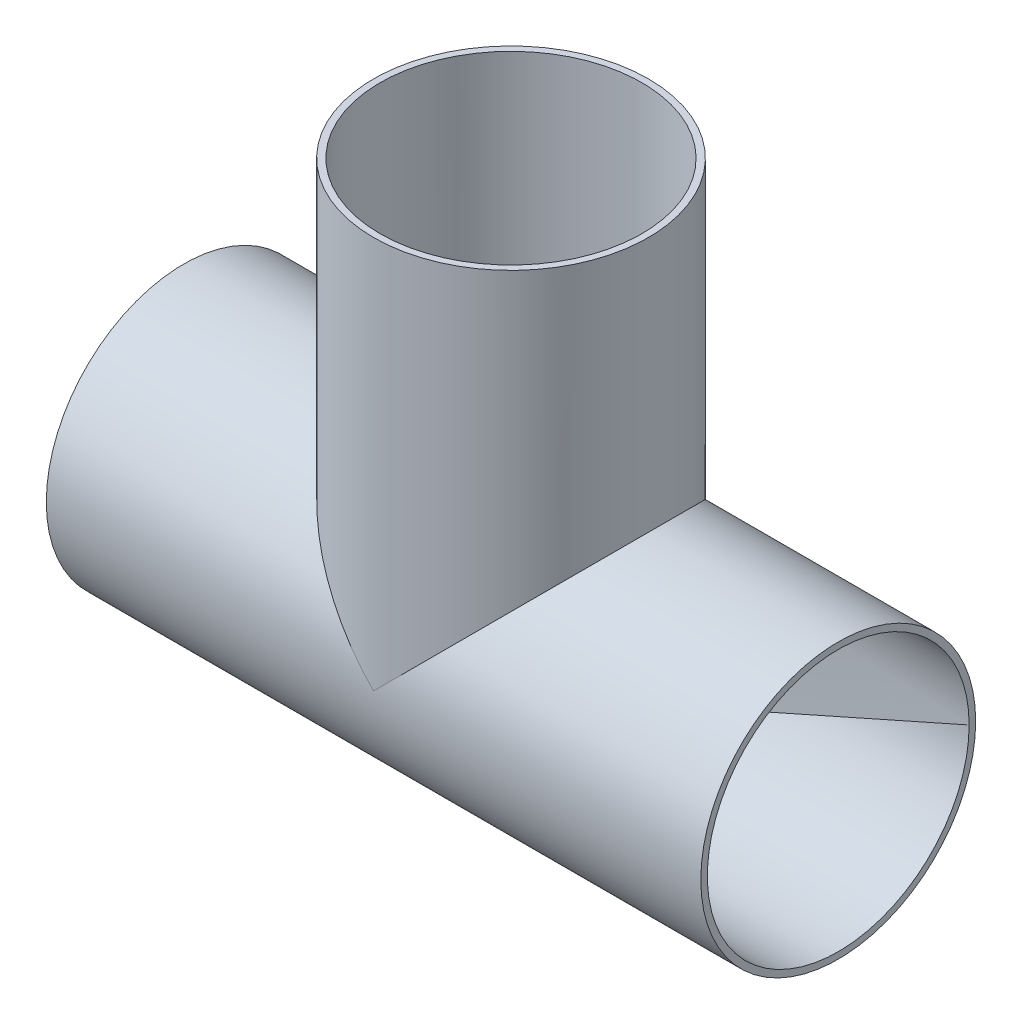
ISO-10303-21;
HEADER;
FILE_DESCRIPTION(('STEP AP214'),'2;1');
FILE_NAME('part.step','',(''),(''),'','','');
FILE_SCHEMA(('AUTOMOTIVE_DESIGN { 1 0 10303 214 1 1 1 1 }'));
ENDSEC;
DATA;
#1=APPLICATION_CONTEXT('core data for automotive mechanical design processes');
#2=APPLICATION_PROTOCOL_DEFINITION('international standard','automotive_design',2000,#1);
#3=PRODUCT_CONTEXT('',#1,'mechanical');
#4=PRODUCT('Part','Part','',(#3));
#5=PRODUCT_RELATED_PRODUCT_CATEGORY('part','',(#4));
#6=PRODUCT_DEFINITION_FORMATION('','',#4);
#7=PRODUCT_DEFINITION_CONTEXT('part definition',#1,'design');
#8=PRODUCT_DEFINITION('design','',#6,#7);
#9=PRODUCT_DEFINITION_SHAPE('','',#8);
#10=(LENGTH_UNIT() NAMED_UNIT(*) SI_UNIT(.MILLI.,.METRE.));
#11=(NAMED_UNIT(*) PLANE_ANGLE_UNIT() SI_UNIT($,.RADIAN.));
#12=(NAMED_UNIT(*) SI_UNIT($,.STERADIAN.) SOLID_ANGLE_UNIT());
#13=UNCERTAINTY_MEASURE_WITH_UNIT(LENGTH_MEASURE(1.E-05),#10,'distance_accuracy_value','');
#14=(GEOMETRIC_REPRESENTATION_CONTEXT(3) GLOBAL_UNCERTAINTY_ASSIGNED_CONTEXT((#13)) GLOBAL_UNIT_ASSIGNED_CONTEXT((#10,
#11,#12)) REPRESENTATION_CONTEXT('',''));
#15=CARTESIAN_POINT('',(0.,0.,0.));
#16=DIRECTION('',(0.,0.,1.));
#17=DIRECTION('',(1.,0.,0.));
#18=AXIS2_PLACEMENT_3D('',#15,#16,#17);
#19=CARTESIAN_POINT('',(125.,0.,0.));
#20=DIRECTION('',(-1.,0.,0.));
#21=DIRECTION('',(0.,0.,1.));
#22=AXIS2_PLACEMENT_3D('',#19,#20,#21);
#23=CYLINDRICAL_SURFACE('',#22,52.5);
#24=CARTESIAN_POINT('',(-125.,0.,0.));
#25=DIRECTION('',(1.,0.,0.));
#26=DIRECTION('',(0.,0.,-1.));
#27=AXIS2_PLACEMENT_3D('',#24,#25,#26);
#28=CIRCLE('',#27,52.5);
#29=CARTESIAN_POINT('',(-125.,0.,-52.5));
#30=VERTEX_POINT('',#29);
#31=EDGE_CURVE('E86',#30,#30,#28,.T.);
#32=ORIENTED_EDGE('',*,*,#31,.T.);
#33=EDGE_LOOP('',(#32));
#34=FACE_BOUND('',#33,.T.);
#35=CARTESIAN_POINT('',(125.,0.,0.));
#36=DIRECTION('',(1.,0.,0.));
#37=DIRECTION('',(0.,0.,-1.));
#38=AXIS2_PLACEMENT_3D('',#35,#36,#37);
#39=CIRCLE('',#38,52.5);
#40=CARTESIAN_POINT('',(125.,0.,-52.5));
#41=VERTEX_POINT('',#40);
#42=EDGE_CURVE('E63',#41,#41,#39,.T.);
#43=ORIENTED_EDGE('',*,*,#42,.F.);
#44=EDGE_LOOP('',(#43));
#45=FACE_BOUND('',#44,.T.);
#46=CARTESIAN_POINT('',(0.,0.,0.));
#47=DIRECTION('',(-0.707106781186547,-0.707106781186547,0.));
#48=DIRECTION('',(-0.707106781186547,0.707106781186547,0.));
#49=AXIS2_PLACEMENT_3D('',#46,#47,#48);
#50=ELLIPSE('',#49,74.2462120245875,52.5);
#51=CARTESIAN_POINT('',(0.,0.,-52.5));
#52=VERTEX_POINT('',#51);
#53=CARTESIAN_POINT('',(0.,0.,52.5));
#54=VERTEX_POINT('',#53);
#55=EDGE_CURVE('E80',#52,#54,#50,.F.);
#56=ORIENTED_EDGE('',*,*,#55,.F.);
#57=CARTESIAN_POINT('',(0.,0.,0.));
#58=DIRECTION('',(-0.707106781186547,0.707106781186547,0.));
#59=DIRECTION('',(-0.707106781186547,-0.707106781186547,0.));
#60=AXIS2_PLACEMENT_3D('',#57,#58,#59);
#61=ELLIPSE('',#60,74.2462120245875,52.5);
#62=EDGE_CURVE('E55',#54,#52,#61,.T.);
#63=ORIENTED_EDGE('',*,*,#62,.F.);
#64=EDGE_LOOP('',(#56,#63));
#65=FACE_BOUND('',#64,.T.);
#66=ADVANCED_FACE('F37',(#34,#45,#65),#23,.T.);
#67=CARTESIAN_POINT('',(125.,0.,0.));
#68=DIRECTION('',(-1.,0.,0.));
#69=DIRECTION('',(0.,0.,1.));
#70=AXIS2_PLACEMENT_3D('',#67,#68,#69);
#71=CYLINDRICAL_SURFACE('',#70,50.);
#72=CARTESIAN_POINT('',(0.,0.,0.));
#73=DIRECTION('',(0.707106781186547,-0.707106781186547,0.));
#74=DIRECTION('',(-0.707106781186547,-0.707106781186547,0.));
#75=AXIS2_PLACEMENT_3D('',#72,#73,#74);
#76=ELLIPSE('',#75,70.7106781186548,50.);
#77=CARTESIAN_POINT('',(0.,0.,50.));
#78=VERTEX_POINT('',#77);
#79=CARTESIAN_POINT('',(0.,0.,-50.));
#80=VERTEX_POINT('',#79);
#81=EDGE_CURVE('E44',#78,#80,#76,.F.);
#82=ORIENTED_EDGE('',*,*,#81,.T.);
#83=CARTESIAN_POINT('',(0.,0.,0.));
#84=DIRECTION('',(-0.707106781186547,-0.707106781186547,0.));
#85=DIRECTION('',(0.707106781186547,-0.707106781186547,0.));
#86=AXIS2_PLACEMENT_3D('',#83,#84,#85);
#87=ELLIPSE('',#86,70.7106781186548,50.);
#88=EDGE_CURVE('E11',#80,#78,#87,.F.);
#89=ORIENTED_EDGE('',*,*,#88,.T.);
#90=EDGE_LOOP('',(#82,#89));
#91=FACE_BOUND('',#90,.T.);
#92=CARTESIAN_POINT('',(125.,0.,0.));
#93=DIRECTION('',(1.,0.,0.));
#94=DIRECTION('',(0.,0.,-1.));
#95=AXIS2_PLACEMENT_3D('',#92,#93,#94);
#96=CIRCLE('',#95,50.);
#97=CARTESIAN_POINT('',(125.,0.,-50.));
#98=VERTEX_POINT('',#97);
#99=EDGE_CURVE('E83',#98,#98,#96,.T.);
#100=ORIENTED_EDGE('',*,*,#99,.T.);
#101=EDGE_LOOP('',(#100));
#102=FACE_BOUND('',#101,.T.);
#103=CARTESIAN_POINT('',(-125.,0.,0.));
#104=DIRECTION('',(1.,0.,0.));
#105=DIRECTION('',(0.,0.,-1.));
#106=AXIS2_PLACEMENT_3D('',#103,#104,#105);
#107=CIRCLE('',#106,50.);
#108=CARTESIAN_POINT('',(-125.,0.,-50.));
#109=VERTEX_POINT('',#108);
#110=EDGE_CURVE('E82',#109,#109,#107,.T.);
#111=ORIENTED_EDGE('',*,*,#110,.F.);
#112=EDGE_LOOP('',(#111));
#113=FACE_BOUND('',#112,.T.);
#114=ADVANCED_FACE('F61',(#91,#102,#113),#71,.F.);
#115=CARTESIAN_POINT('',(125.,0.,0.));
#116=DIRECTION('',(1.,0.,0.));
#117=DIRECTION('',(0.,0.,-1.));
#118=AXIS2_PLACEMENT_3D('',#115,#116,#117);
#119=PLANE('',#118);
#120=ORIENTED_EDGE('',*,*,#42,.T.);
#121=EDGE_LOOP('',(#120));
#122=FACE_BOUND('',#121,.T.);
#123=ORIENTED_EDGE('',*,*,#99,.F.);
#124=EDGE_LOOP('',(#123));
#125=FACE_BOUND('',#124,.T.);
#126=ADVANCED_FACE('F99',(#122,#125),#119,.T.);
#127=CARTESIAN_POINT('',(-125.,0.,0.));
#128=DIRECTION('',(1.,0.,0.));
#129=DIRECTION('',(0.,0.,-1.));
#130=AXIS2_PLACEMENT_3D('',#127,#128,#129);
#131=PLANE('',#130);
#132=ORIENTED_EDGE('',*,*,#31,.F.);
#133=EDGE_LOOP('',(#132));
#134=FACE_BOUND('',#133,.T.);
#135=ORIENTED_EDGE('',*,*,#110,.T.);
#136=EDGE_LOOP('',(#135));
#137=FACE_BOUND('',#136,.T.);
#138=ADVANCED_FACE('F96',(#134,#137),#131,.F.);
#139=CARTESIAN_POINT('',(0.,150.,0.));
#140=DIRECTION('',(0.,-1.,0.));
#141=DIRECTION('',(0.,0.,-1.));
#142=AXIS2_PLACEMENT_3D('',#139,#140,#141);
#143=CYLINDRICAL_SURFACE('',#142,52.5);
#144=CARTESIAN_POINT('',(0.,150.,0.));
#145=DIRECTION('',(0.,1.,0.));
#146=DIRECTION('',(0.,0.,1.));
#147=AXIS2_PLACEMENT_3D('',#144,#145,#146);
#148=CIRCLE('',#147,52.5);
#149=CARTESIAN_POINT('',(0.,150.,52.5));
#150=VERTEX_POINT('',#149);
#151=EDGE_CURVE('E74',#150,#150,#148,.T.);
#152=ORIENTED_EDGE('',*,*,#151,.F.);
#153=EDGE_LOOP('',(#152));
#154=FACE_BOUND('',#153,.T.);
#155=ORIENTED_EDGE('',*,*,#62,.T.);
#156=ORIENTED_EDGE('',*,*,#55,.T.);
#157=EDGE_LOOP('',(#155,#156));
#158=FACE_BOUND('',#157,.T.);
#159=ADVANCED_FACE('F68',(#154,#158),#143,.T.);
#160=CARTESIAN_POINT('',(0.,150.,0.));
#161=DIRECTION('',(0.,-1.,0.));
#162=DIRECTION('',(0.,0.,-1.));
#163=AXIS2_PLACEMENT_3D('',#160,#161,#162);
#164=CYLINDRICAL_SURFACE('',#163,50.);
#165=ORIENTED_EDGE('',*,*,#88,.F.);
#166=ORIENTED_EDGE('',*,*,#81,.F.);
#167=EDGE_LOOP('',(#165,#166));
#168=FACE_BOUND('',#167,.T.);
#169=CARTESIAN_POINT('',(0.,150.,0.));
#170=DIRECTION('',(0.,1.,0.));
#171=DIRECTION('',(0.,0.,1.));
#172=AXIS2_PLACEMENT_3D('',#169,#170,#171);
#173=CIRCLE('',#172,50.);
#174=CARTESIAN_POINT('',(0.,150.,50.));
#175=VERTEX_POINT('',#174);
#176=EDGE_CURVE('E72',#175,#175,#173,.T.);
#177=ORIENTED_EDGE('',*,*,#176,.T.);
#178=EDGE_LOOP('',(#177));
#179=FACE_BOUND('',#178,.T.);
#180=ADVANCED_FACE('F64',(#168,#179),#164,.F.);
#181=CARTESIAN_POINT('',(0.,150.,0.));
#182=DIRECTION('',(0.,1.,0.));
#183=DIRECTION('',(0.,0.,1.));
#184=AXIS2_PLACEMENT_3D('',#181,#182,#183);
#185=PLANE('',#184);
#186=ORIENTED_EDGE('',*,*,#151,.T.);
#187=EDGE_LOOP('',(#186));
#188=FACE_BOUND('',#187,.T.);
#189=ORIENTED_EDGE('',*,*,#176,.F.);
#190=EDGE_LOOP('',(#189));
#191=FACE_BOUND('',#190,.T.);
#192=ADVANCED_FACE('F67',(#188,#191),#185,.T.);
#193=CLOSED_SHELL('',(#66,#114,#126,#138,#159,#180,#192));
#194=MANIFOLD_SOLID_BREP('B2',#193);
#195=ADVANCED_BREP_SHAPE_REPRESENTATION('',(#18,#194),#14);
#196=SHAPE_DEFINITION_REPRESENTATION(#9,#195);
ENDSEC;
END-ISO-10303-21;
